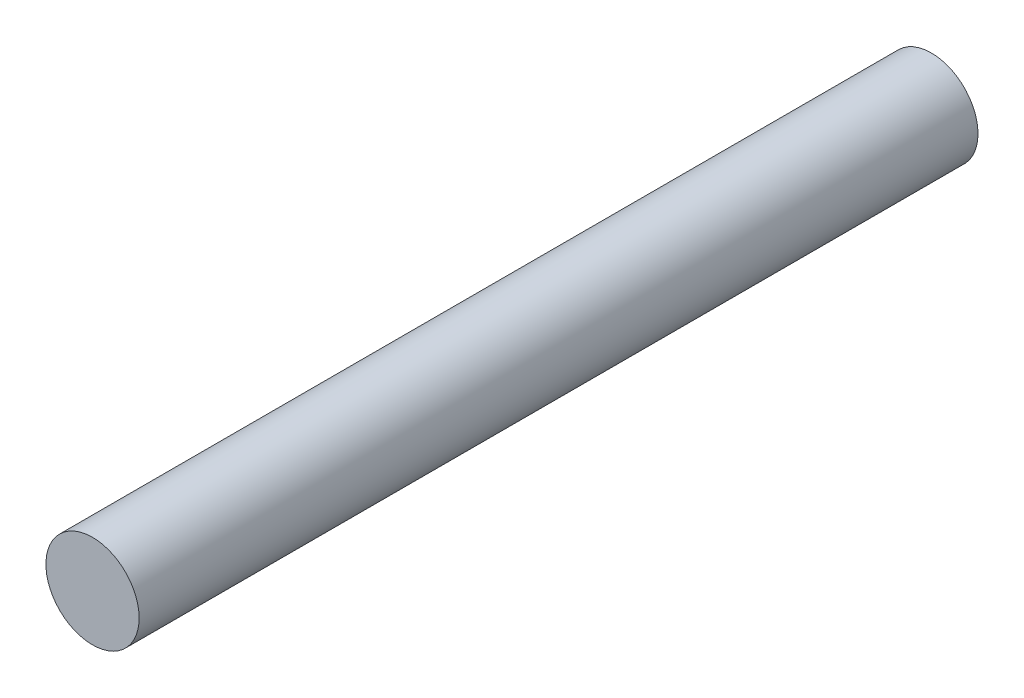
ISO-10303-21;
HEADER;
FILE_DESCRIPTION(('STEP AP214'),'2;1');
FILE_NAME('part.step','',(''),(''),'','','');
FILE_SCHEMA(('AUTOMOTIVE_DESIGN { 1 0 10303 214 1 1 1 1 }'));
ENDSEC;
DATA;
#1=APPLICATION_CONTEXT('core data for automotive mechanical design processes');
#2=APPLICATION_PROTOCOL_DEFINITION('international standard','automotive_design',2000,#1);
#3=PRODUCT_CONTEXT('',#1,'mechanical');
#4=PRODUCT('Part','Part','',(#3));
#5=PRODUCT_RELATED_PRODUCT_CATEGORY('part','',(#4));
#6=PRODUCT_DEFINITION_FORMATION('','',#4);
#7=PRODUCT_DEFINITION_CONTEXT('part definition',#1,'design');
#8=PRODUCT_DEFINITION('design','',#6,#7);
#9=PRODUCT_DEFINITION_SHAPE('','',#8);
#10=(LENGTH_UNIT() NAMED_UNIT(*) SI_UNIT(.MILLI.,.METRE.));
#11=(NAMED_UNIT(*) PLANE_ANGLE_UNIT() SI_UNIT($,.RADIAN.));
#12=(NAMED_UNIT(*) SI_UNIT($,.STERADIAN.) SOLID_ANGLE_UNIT());
#13=UNCERTAINTY_MEASURE_WITH_UNIT(LENGTH_MEASURE(1.E-05),#10,'distance_accuracy_value','');
#14=(GEOMETRIC_REPRESENTATION_CONTEXT(3) GLOBAL_UNCERTAINTY_ASSIGNED_CONTEXT((#13)) GLOBAL_UNIT_ASSIGNED_CONTEXT((#10,
#11,#12)) REPRESENTATION_CONTEXT('',''));
#15=CARTESIAN_POINT('',(0.,0.,0.));
#16=DIRECTION('',(0.,0.,1.));
#17=DIRECTION('',(1.,0.,0.));
#18=AXIS2_PLACEMENT_3D('',#15,#16,#17);
#19=CARTESIAN_POINT('',(-11.4453546649931,3.60552928947074,63.));
#20=DIRECTION('',(0.,0.,-1.));
#21=DIRECTION('',(-1.,0.,0.));
#22=AXIS2_PLACEMENT_3D('',#19,#20,#21);
#23=CYLINDRICAL_SURFACE('',#22,3.5);
#24=CARTESIAN_POINT('',(-11.4453546649931,3.60552928947074,63.));
#25=DIRECTION('',(0.,0.,1.));
#26=DIRECTION('',(1.,0.,0.));
#27=AXIS2_PLACEMENT_3D('',#24,#25,#26);
#28=CIRCLE('',#27,3.5);
#29=CARTESIAN_POINT('',(-7.94535466499314,3.60552928947074,63.));
#30=VERTEX_POINT('',#29);
#31=EDGE_CURVE('E10',#30,#30,#28,.T.);
#32=ORIENTED_EDGE('',*,*,#31,.F.);
#33=EDGE_LOOP('',(#32));
#34=FACE_BOUND('',#33,.T.);
#35=CARTESIAN_POINT('',(-11.4453546649931,3.60552928947074,0.));
#36=DIRECTION('',(0.,0.,1.));
#37=DIRECTION('',(1.,0.,0.));
#38=AXIS2_PLACEMENT_3D('',#35,#36,#37);
#39=CIRCLE('',#38,3.5);
#40=CARTESIAN_POINT('',(-7.94535466499314,3.60552928947074,0.));
#41=VERTEX_POINT('',#40);
#42=EDGE_CURVE('E42',#41,#41,#39,.T.);
#43=ORIENTED_EDGE('',*,*,#42,.T.);
#44=EDGE_LOOP('',(#43));
#45=FACE_BOUND('',#44,.T.);
#46=ADVANCED_FACE('F39',(#34,#45),#23,.T.);
#47=CARTESIAN_POINT('',(-11.4453546649931,3.60552928947074,63.));
#48=DIRECTION('',(0.,0.,1.));
#49=DIRECTION('',(1.,0.,0.));
#50=AXIS2_PLACEMENT_3D('',#47,#48,#49);
#51=PLANE('',#50);
#52=ORIENTED_EDGE('',*,*,#31,.T.);
#53=EDGE_LOOP('',(#52));
#54=FACE_BOUND('',#53,.T.);
#55=ADVANCED_FACE('F56',(#54),#51,.T.);
#56=CARTESIAN_POINT('',(-11.4453546649931,3.60552928947074,0.));
#57=DIRECTION('',(0.,0.,1.));
#58=DIRECTION('',(1.,0.,0.));
#59=AXIS2_PLACEMENT_3D('',#56,#57,#58);
#60=PLANE('',#59);
#61=ORIENTED_EDGE('',*,*,#42,.F.);
#62=EDGE_LOOP('',(#61));
#63=FACE_BOUND('',#62,.T.);
#64=ADVANCED_FACE('F54',(#63),#60,.F.);
#65=CLOSED_SHELL('',(#46,#55,#64));
#66=MANIFOLD_SOLID_BREP('B2',#65);
#67=ADVANCED_BREP_SHAPE_REPRESENTATION('',(#18,#66),#14);
#68=SHAPE_DEFINITION_REPRESENTATION(#9,#67);
ENDSEC;
END-ISO-10303-21;
